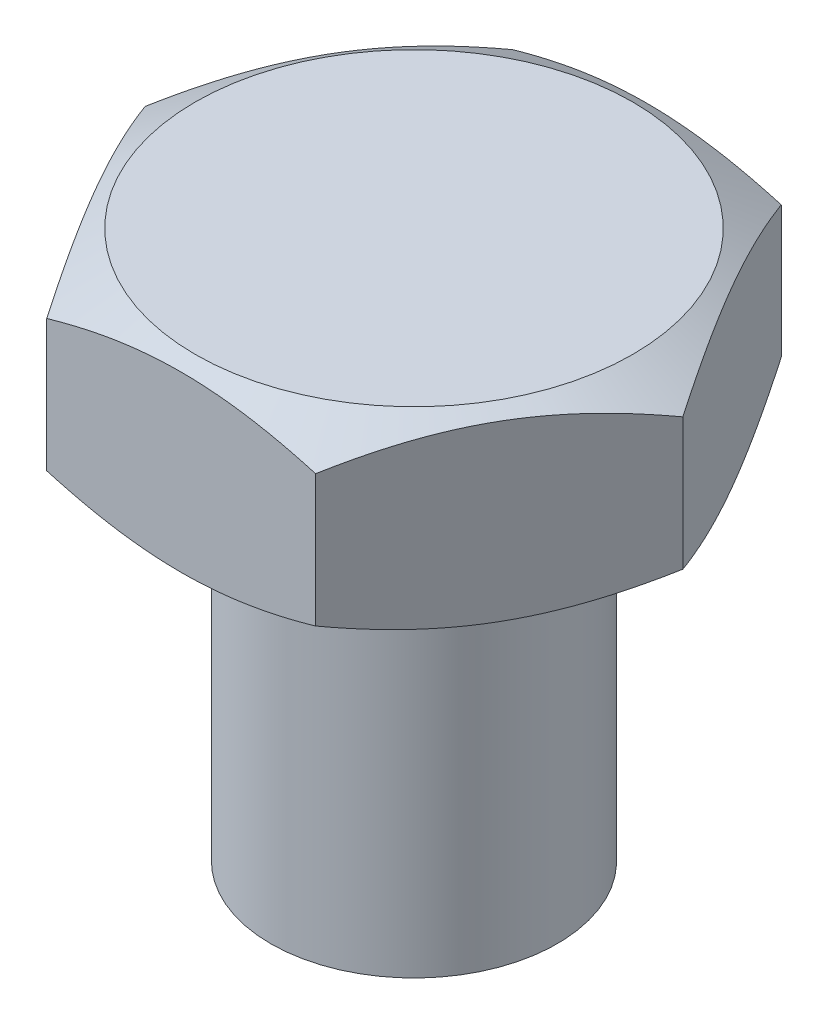
ISO-10303-21;
HEADER;
FILE_DESCRIPTION(('STEP AP214'),'2;1');
FILE_NAME('part.step','',(''),(''),'','','');
FILE_SCHEMA(('AUTOMOTIVE_DESIGN { 1 0 10303 214 1 1 1 1 }'));
ENDSEC;
DATA;
#1=APPLICATION_CONTEXT('core data for automotive mechanical design processes');
#2=APPLICATION_PROTOCOL_DEFINITION('international standard','automotive_design',2000,#1);
#3=PRODUCT_CONTEXT('',#1,'mechanical');
#4=PRODUCT('Part','Part','',(#3));
#5=PRODUCT_RELATED_PRODUCT_CATEGORY('part','',(#4));
#6=PRODUCT_DEFINITION_FORMATION('','',#4);
#7=PRODUCT_DEFINITION_CONTEXT('part definition',#1,'design');
#8=PRODUCT_DEFINITION('design','',#6,#7);
#9=PRODUCT_DEFINITION_SHAPE('','',#8);
#10=(LENGTH_UNIT() NAMED_UNIT(*) SI_UNIT(.MILLI.,.METRE.));
#11=(NAMED_UNIT(*) PLANE_ANGLE_UNIT() SI_UNIT($,.RADIAN.));
#12=(NAMED_UNIT(*) SI_UNIT($,.STERADIAN.) SOLID_ANGLE_UNIT());
#13=UNCERTAINTY_MEASURE_WITH_UNIT(LENGTH_MEASURE(1.E-05),#10,'distance_accuracy_value','');
#14=(GEOMETRIC_REPRESENTATION_CONTEXT(3) GLOBAL_UNCERTAINTY_ASSIGNED_CONTEXT((#13)) GLOBAL_UNIT_ASSIGNED_CONTEXT((#10,
#11,#12)) REPRESENTATION_CONTEXT('',''));
#15=CARTESIAN_POINT('',(0.,0.,0.));
#16=DIRECTION('',(0.,0.,1.));
#17=DIRECTION('',(1.,0.,0.));
#18=AXIS2_PLACEMENT_3D('',#15,#16,#17);
#19=CARTESIAN_POINT('',(0.,-5.3,0.));
#20=DIRECTION('',(0.,1.,0.));
#21=DIRECTION('',(0.,0.,1.));
#22=AXIS2_PLACEMENT_3D('',#19,#20,#21);
#23=PLANE('',#22);
#24=CARTESIAN_POINT('',(0.,-5.3,0.));
#25=DIRECTION('',(0.,-1.,0.));
#26=DIRECTION('',(0.,0.,-1.));
#27=AXIS2_PLACEMENT_3D('',#24,#25,#26);
#28=CIRCLE('',#27,4.);
#29=CARTESIAN_POINT('',(0.,-5.3,-4.));
#30=VERTEX_POINT('',#29);
#31=EDGE_CURVE('E11',#30,#30,#28,.T.);
#32=ORIENTED_EDGE('',*,*,#31,.F.);
#33=EDGE_LOOP('',(#32));
#34=FACE_BOUND('',#33,.T.);
#35=CARTESIAN_POINT('',(0.,-5.29999999999997,0.));
#36=DIRECTION('',(0.,-1.,0.));
#37=DIRECTION('',(1.,0.,0.));
#38=AXIS2_PLACEMENT_3D('',#35,#36,#37);
#39=CIRCLE('',#38,6.10555349946512);
#40=CARTESIAN_POINT('',(6.10555349946513,-5.29999999999995,0.));
#41=VERTEX_POINT('',#40);
#42=EDGE_CURVE('E248',#41,#41,#39,.T.);
#43=ORIENTED_EDGE('',*,*,#42,.T.);
#44=EDGE_LOOP('',(#43));
#45=FACE_BOUND('',#44,.T.);
#46=ADVANCED_FACE('F34',(#34,#45),#23,.F.);
#47=CARTESIAN_POINT('',(0.,-15.3,0.));
#48=DIRECTION('',(0.,1.,0.));
#49=DIRECTION('',(0.,0.,1.));
#50=AXIS2_PLACEMENT_3D('',#47,#48,#49);
#51=CYLINDRICAL_SURFACE('',#50,4.);
#52=CARTESIAN_POINT('',(0.,-15.3,0.));
#53=DIRECTION('',(0.,-1.,0.));
#54=DIRECTION('',(0.,0.,-1.));
#55=AXIS2_PLACEMENT_3D('',#52,#53,#54);
#56=CIRCLE('',#55,4.);
#57=CARTESIAN_POINT('',(0.,-15.3,-4.));
#58=VERTEX_POINT('',#57);
#59=EDGE_CURVE('E122',#58,#58,#56,.T.);
#60=ORIENTED_EDGE('',*,*,#59,.F.);
#61=EDGE_LOOP('',(#60));
#62=FACE_BOUND('',#61,.T.);
#63=ORIENTED_EDGE('',*,*,#31,.T.);
#64=EDGE_LOOP('',(#63));
#65=FACE_BOUND('',#64,.T.);
#66=ADVANCED_FACE('F230',(#62,#65),#51,.T.);
#67=CARTESIAN_POINT('',(0.,-15.3,0.));
#68=DIRECTION('',(0.,-1.,0.));
#69=DIRECTION('',(0.,0.,-1.));
#70=AXIS2_PLACEMENT_3D('',#67,#68,#69);
#71=PLANE('',#70);
#72=ORIENTED_EDGE('',*,*,#59,.T.);
#73=EDGE_LOOP('',(#72));
#74=FACE_BOUND('',#73,.T.);
#75=ADVANCED_FACE('F146',(#74),#71,.T.);
#76=CARTESIAN_POINT('',(0.,-4.4917096231345,0.));
#77=DIRECTION('',(0.,1.,0.));
#78=DIRECTION('',(-1.,0.,0.));
#79=AXIS2_PLACEMENT_3D('',#76,#77,#78);
#80=CONICAL_SURFACE('',#79,7.50555349946512,1.0471975511966);
#81=CARTESIAN_POINT('',(7.50566896951897,-4.49164295492937,-0.0002));
#82=CARTESIAN_POINT('',(7.4231786300702,-4.53926178365975,0.14267745905888));
#83=CARTESIAN_POINT('',(7.34038072665458,-4.58471950613253,0.286087634534912));
#84=CARTESIAN_POINT('',(7.17411251123976,-4.67071752471219,0.574072631317194));
#85=CARTESIAN_POINT('',(7.09064192560665,-4.71125569950721,0.718647926571262));
#86=CARTESIAN_POINT('',(6.83889369625719,-4.82469520561203,1.15468865052003));
#87=CARTESIAN_POINT('',(6.66962231516081,-4.8892183996065,1.44787528284632));
#88=CARTESIAN_POINT('',(6.41631077211555,-4.96487962318775,1.88662374554437));
#89=CARTESIAN_POINT('',(6.33302748139454,-4.98643335027825,2.03087463649469));
#90=CARTESIAN_POINT('',(6.16608458377293,-5.02257589212912,2.32002821713808));
#91=CARTESIAN_POINT('',(6.08242501078143,-5.03716532227557,2.46493084809888));
#92=CARTESIAN_POINT('',(5.91496056339807,-5.05900745422789,2.75498777942831));
#93=CARTESIAN_POINT('',(5.83115596252171,-5.06626848241313,2.9001416060542));
#94=CARTESIAN_POINT('',(5.66347396979287,-5.07330590415301,3.19057533697494));
#95=CARTESIAN_POINT('',(5.5795965802691,-5.07308252892304,3.33585523723635));
#96=CARTESIAN_POINT('',(5.34979921898454,-5.06218274822008,3.73387594242649));
#97=CARTESIAN_POINT('',(5.20395446807007,-5.04388438886583,3.98648646102756));
#98=CARTESIAN_POINT('',(4.91323365606636,-4.98585986527757,4.49002967823567));
#99=CARTESIAN_POINT('',(4.76835861741226,-4.946113868197,4.74096060593308));
#100=CARTESIAN_POINT('',(4.47705272008732,-4.8467603035331,5.24551722064432));
#101=CARTESIAN_POINT('',(4.33065861912703,-4.78673178109722,5.49907924143591));
#102=CARTESIAN_POINT('',(4.04005357906494,-4.65049121422538,6.00242193575904));
#103=CARTESIAN_POINT('',(3.89583891821181,-4.57431117257165,6.25220905555296));
#104=CARTESIAN_POINT('',(3.75266127967873,-4.49164295492938,6.5002));
#105=B_SPLINE_CURVE_WITH_KNOTS('',3,(#81,#82,#83,#84,#85,#86,#87,#88,#89,#90,#91,#92,#93,#94,
#95,#96,#97,#98,#99,#100,#101,#102,#103,#104),.UNSPECIFIED.,.F.,.F.,(4,2,2,2,2,2,2,2,2,2,2,4),
(0.,0.515105052395587,1.03043143507524,2.06322554824262,2.56697389547996,3.07067772176453,
3.57380860368927,4.07692394242519,4.95279354705659,5.82947446853466,6.72559912449736,
7.61996451221046),.UNSPECIFIED.);
#106=CARTESIAN_POINT('',(7.50555349946513,-4.49170962313447,0.));
#107=VERTEX_POINT('',#106);
#108=CARTESIAN_POINT('',(3.75277674973255,-4.49170962313449,6.5));
#109=VERTEX_POINT('',#108);
#110=EDGE_CURVE('E124',#107,#109,#105,.T.);
#111=ORIENTED_EDGE('',*,*,#110,.T.);
#112=CARTESIAN_POINT('',(11.3019281117872,-1.29768000423356,6.5));
#113=CARTESIAN_POINT('',(11.0315442073955,-1.43298117627786,6.50000000000001));
#114=CARTESIAN_POINT('',(10.7606895945603,-1.56735154297265,6.5));
#115=CARTESIAN_POINT('',(10.2178242665555,-1.83378067994195,6.5));
#116=CARTESIAN_POINT('',(9.94581347569086,-1.96583929587607,6.5));
#117=CARTESIAN_POINT('',(9.39990899805895,-2.2274394407436,6.5));
#118=CARTESIAN_POINT('',(9.1260126257971,-2.35697537747918,6.5));
#119=CARTESIAN_POINT('',(8.5766336187353,-2.61263099590845,6.5));
#120=CARTESIAN_POINT('',(8.30115101502996,-2.7387507442945,6.5));
#121=CARTESIAN_POINT('',(7.73583209505941,-2.992375989736,6.5));
#122=CARTESIAN_POINT('',(7.44590853713248,-3.11968766813497,6.5));
#123=CARTESIAN_POINT('',(6.86357053866705,-3.36854070197247,6.5));
#124=CARTESIAN_POINT('',(6.57115598763215,-3.49008179984887,6.5));
#125=CARTESIAN_POINT('',(5.9835492824468,-3.72575562647278,6.5));
#126=CARTESIAN_POINT('',(5.68835896417307,-3.83989290482871,6.5));
#127=CARTESIAN_POINT('',(5.09453049652117,-4.05877080224702,6.5));
#128=CARTESIAN_POINT('',(4.79589272842483,-4.16351244942186,6.5));
#129=CARTESIAN_POINT('',(4.12445080627299,-4.38402568247454,6.5));
#130=CARTESIAN_POINT('',(3.75060280171319,-4.49666688484459,6.5));
#131=CARTESIAN_POINT('',(2.99616163988092,-4.69728061936889,6.5));
#132=CARTESIAN_POINT('',(2.61556907344103,-4.78525530109634,6.5));
#133=CARTESIAN_POINT('',(2.04341381568623,-4.89254169293435,6.5));
#134=CARTESIAN_POINT('',(1.85411260014898,-4.92402360215149,6.5));
#135=CARTESIAN_POINT('',(1.47429273056311,-4.97841144020082,6.5));
#136=CARTESIAN_POINT('',(1.28377425654348,-5.00131860865851,6.5));
#137=CARTESIAN_POINT('',(0.901899889731628,-5.03787223099909,6.5));
#138=CARTESIAN_POINT('',(0.710544256730136,-5.05152137750366,6.5));
#139=CARTESIAN_POINT('',(0.327383506002614,-5.06912688399632,6.5));
#140=CARTESIAN_POINT('',(0.135578390239827,-5.07308328624151,6.5));
#141=CARTESIAN_POINT('',(-0.249151630953956,-5.07116273322381,6.5));
#142=CARTESIAN_POINT('',(-0.442076235833894,-5.06522569426935,6.5));
#143=CARTESIAN_POINT('',(-0.827373295022535,-5.04360696050267,6.5));
#144=CARTESIAN_POINT('',(-1.0197457468752,-5.02792522241226,6.5));
#145=CARTESIAN_POINT('',(-1.40357819038102,-4.98731734189005,6.5));
#146=CARTESIAN_POINT('',(-1.59503780893507,-4.96238770118649,6.5));
#147=CARTESIAN_POINT('',(-1.97664492894402,-4.90402046965219,6.5));
#148=CARTESIAN_POINT('',(-2.1667923842743,-4.87058258129199,6.5));
#149=CARTESIAN_POINT('',(-2.74136892765638,-4.75752941361289,6.5));
#150=CARTESIAN_POINT('',(-3.12345414780365,-4.66590938619134,6.5));
#151=CARTESIAN_POINT('',(-3.88101544565185,-4.45847823965152,6.5));
#152=CARTESIAN_POINT('',(-4.25648765465189,-4.34265343883489,6.5));
#153=CARTESIAN_POINT('',(-4.92324921436207,-4.11933451608864,6.5));
#154=CARTESIAN_POINT('',(-5.21567685661719,-4.01518883029879,6.5));
#155=CARTESIAN_POINT('',(-5.79717131449654,-3.79818311821834,6.5));
#156=CARTESIAN_POINT('',(-6.08623903230838,-3.68532549645334,6.5));
#157=CARTESIAN_POINT('',(-6.66178041093166,-3.4526721407869,6.5));
#158=CARTESIAN_POINT('',(-6.94825218343323,-3.33287176231593,6.5));
#159=CARTESIAN_POINT('',(-7.51886907109701,-3.08782417914273,6.5));
#160=CARTESIAN_POINT('',(-7.80301404091938,-2.96257663723022,6.5));
#161=CARTESIAN_POINT('',(-8.35731691761997,-2.71314446113502,6.5));
#162=CARTESIAN_POINT('',(-8.62755639841104,-2.5891405416267,6.49999999999999));
#163=CARTESIAN_POINT('',(-9.16651283869878,-2.33788363270034,6.49999999999999));
#164=CARTESIAN_POINT('',(-9.43522982178719,-2.21063069379639,6.49999999999999));
#165=CARTESIAN_POINT('',(-9.97090107510541,-1.95368597294006,6.49999999999999));
#166=CARTESIAN_POINT('',(-10.2378576396399,-1.82399896440976,6.49999999999999));
#167=CARTESIAN_POINT('',(-10.7706701519885,-1.56240065601994,6.49999999999999));
#168=CARTESIAN_POINT('',(-11.0365261304524,-1.4304894186281,6.49999999999999));
#169=CARTESIAN_POINT('',(-11.3019281117872,-1.29768000423363,6.49999999999999));
#170=B_SPLINE_CURVE_WITH_KNOTS('',3,(#112,#113,#114,#115,#116,#117,#118,#119,#120,#121,#122,
#123,#124,#125,#126,#127,#128,#129,#130,#131,#132,#133,#134,#135,#136,#137,#138,#139,#140,#141,
#142,#143,#144,#145,#146,#147,#148,#149,#150,#151,#152,#153,#154,#155,#156,#157,#158,#159,#160,
#161,#162,#163,#164,#165,#166,#167,#168,#169),.UNSPECIFIED.,.F.,.F.,(4,2,2,2,2,2,2,2,2,2,2,2,2,
2,2,2,2,2,2,2,2,2,2,2,2,2,2,2,4),(0.,0.907046539019097,1.81415340637229,2.72308335702887,
3.63199555033877,4.58188030800966,5.531807422736,6.48114517167283,7.43037891273764,
8.60113651357925,9.77179205657693,10.3473319165037,10.9227885401327,11.498077724955,
12.0733644017054,12.6521575905371,13.2309533499256,13.8099682782555,14.3890034572512,
15.5665682229691,16.7448004138993,17.6758961584318,18.6067358297722,19.538205568934,
20.4697330536554,21.3617036969262,22.2536604807301,23.1440206120042,24.0343557789488),.UNSPECIFIED.);
#171=CARTESIAN_POINT('',(-3.75277674973259,-4.49170962313451,6.49999999999996));
#172=VERTEX_POINT('',#171);
#173=EDGE_CURVE('E107',#109,#172,#170,.T.);
#174=ORIENTED_EDGE('',*,*,#173,.T.);
#175=CARTESIAN_POINT('',(-3.75266127967873,-4.49164295492939,6.5002));
#176=CARTESIAN_POINT('',(-3.83515161912751,-4.53926178365978,6.35732254094112));
#177=CARTESIAN_POINT('',(-3.91794952254312,-4.58471950613256,6.21391236546508));
#178=CARTESIAN_POINT('',(-4.08421773795795,-4.67071752471222,5.9259273686828));
#179=CARTESIAN_POINT('',(-4.16768832359106,-4.71125569950724,5.78135207342873));
#180=CARTESIAN_POINT('',(-4.41943655294052,-4.82469520561205,5.34531134947996));
#181=CARTESIAN_POINT('',(-4.5887079340369,-4.88921839960652,5.05212471715368));
#182=CARTESIAN_POINT('',(-4.84201947708215,-4.96487962318777,4.61337625445562));
#183=CARTESIAN_POINT('',(-4.92530276780316,-4.98643335027827,4.4691253635053));
#184=CARTESIAN_POINT('',(-5.09224566542477,-5.02257589212914,4.17997178286191));
#185=CARTESIAN_POINT('',(-5.17590523841628,-5.0371653222756,4.03506915190111));
#186=CARTESIAN_POINT('',(-5.34336968579964,-5.05900745422792,3.74501222057167));
#187=CARTESIAN_POINT('',(-5.427174286676,-5.06626848241315,3.59985839394578));
#188=CARTESIAN_POINT('',(-5.59485627940484,-5.07330590415303,3.30942466302505));
#189=CARTESIAN_POINT('',(-5.6787336689286,-5.07308252892306,3.16414476276364));
#190=CARTESIAN_POINT('',(-5.90853103021317,-5.0621827482201,2.7661240575735));
#191=CARTESIAN_POINT('',(-6.05437578112764,-5.04388438886585,2.51351353897242));
#192=CARTESIAN_POINT('',(-6.34509659313135,-4.98585986527759,2.00997032176432));
#193=CARTESIAN_POINT('',(-6.48997163178545,-4.94611386819702,1.75903939406691));
#194=CARTESIAN_POINT('',(-6.78127752911039,-4.84676030353312,1.25448277935567));
#195=CARTESIAN_POINT('',(-6.92767163007068,-4.78673178109724,1.00092075856408));
#196=CARTESIAN_POINT('',(-7.21827667013277,-4.6504912142254,0.497578064240952));
#197=CARTESIAN_POINT('',(-7.36249133098589,-4.57431117257168,0.247790944447034));
#198=CARTESIAN_POINT('',(-7.50566896951897,-4.4916429549294,-0.000200000000002116));
#199=B_SPLINE_CURVE_WITH_KNOTS('',3,(#175,#176,#177,#178,#179,#180,#181,#182,#183,#184,#185,
#186,#187,#188,#189,#190,#191,#192,#193,#194,#195,#196,#197,#198),.UNSPECIFIED.,.F.,.F.,(4,2,2,
2,2,2,2,2,2,2,2,4),(0.,0.515105052395587,1.03043143507525,2.06322554824262,2.56697389547997,
3.07067772176454,3.57380860368928,4.0769239424252,4.9527935470566,5.82947446853466,
6.72559912449736,7.61996451221045),.UNSPECIFIED.);
#200=CARTESIAN_POINT('',(-7.5055534994651,-4.49170962313452,0.));
#201=VERTEX_POINT('',#200);
#202=EDGE_CURVE('E172',#172,#201,#199,.T.);
#203=ORIENTED_EDGE('',*,*,#202,.T.);
#204=CARTESIAN_POINT('',(-7.50566896951897,-4.4916429549294,0.000199999999998251));
#205=CARTESIAN_POINT('',(-7.4231786300702,-4.53926178365978,-0.142677459058883));
#206=CARTESIAN_POINT('',(-7.34038072665458,-4.58471950613256,-0.286087634534915));
#207=CARTESIAN_POINT('',(-7.17411251123975,-4.67071752471222,-0.574072631317198));
#208=CARTESIAN_POINT('',(-7.09064192560665,-4.71125569950724,-0.718647926571267));
#209=CARTESIAN_POINT('',(-6.83889369625718,-4.82469520561206,-1.15468865052004));
#210=CARTESIAN_POINT('',(-6.6696223151608,-4.88921839960653,-1.44787528284632));
#211=CARTESIAN_POINT('',(-6.41631077211555,-4.96487962318777,-1.88662374554438));
#212=CARTESIAN_POINT('',(-6.33302748139454,-4.98643335027828,-2.0308746364947));
#213=CARTESIAN_POINT('',(-6.16608458377293,-5.02257589212915,-2.32002821713809));
#214=CARTESIAN_POINT('',(-6.08242501078142,-5.0371653222756,-2.4649308480989));
#215=CARTESIAN_POINT('',(-5.91496056339806,-5.05900745422792,-2.75498777942833));
#216=CARTESIAN_POINT('',(-5.8311559625217,-5.06626848241315,-2.90014160605422));
#217=CARTESIAN_POINT('',(-5.66347396979286,-5.07330590415303,-3.19057533697496));
#218=CARTESIAN_POINT('',(-5.57959658026909,-5.07308252892306,-3.33585523723637));
#219=CARTESIAN_POINT('',(-5.34979921898453,-5.0621827482201,-3.7338759424265));
#220=CARTESIAN_POINT('',(-5.20395446807006,-5.04388438886585,-3.98648646102758));
#221=CARTESIAN_POINT('',(-4.91323365606635,-4.98585986527759,-4.49002967823569));
#222=CARTESIAN_POINT('',(-4.76835861741225,-4.94611386819702,-4.74096060593309));
#223=CARTESIAN_POINT('',(-4.47705272008731,-4.84676030353311,-5.24551722064433));
#224=CARTESIAN_POINT('',(-4.33065861912702,-4.78673178109723,-5.49907924143592));
#225=CARTESIAN_POINT('',(-4.04005357906493,-4.65049121422539,-6.00242193575905));
#226=CARTESIAN_POINT('',(-3.89583891821181,-4.57431117257167,-6.25220905555296));
#227=CARTESIAN_POINT('',(-3.75266127967873,-4.49164295492939,-6.5002));
#228=B_SPLINE_CURVE_WITH_KNOTS('',3,(#204,#205,#206,#207,#208,#209,#210,#211,#212,#213,#214,
#215,#216,#217,#218,#219,#220,#221,#222,#223,#224,#225,#226,#227),.UNSPECIFIED.,.F.,.F.,(4,2,2,
2,2,2,2,2,2,2,2,4),(0.,0.515105052395589,1.03043143507525,2.06322554824263,2.56697389547997,
3.07067772176454,3.57380860368928,4.07692394242521,4.95279354705661,5.82947446853467,
6.72559912449736,7.61996451221045),.UNSPECIFIED.);
#229=CARTESIAN_POINT('',(-3.75277674973252,-4.49170962313451,-6.5));
#230=VERTEX_POINT('',#229);
#231=EDGE_CURVE('E166',#201,#230,#228,.T.);
#232=ORIENTED_EDGE('',*,*,#231,.T.);
#233=CARTESIAN_POINT('',(-11.3019281117872,-1.29768000423363,-6.5));
#234=CARTESIAN_POINT('',(-11.0315442073955,-1.43298117627793,-6.50000000000001));
#235=CARTESIAN_POINT('',(-10.7606895945603,-1.56735154297272,-6.5));
#236=CARTESIAN_POINT('',(-10.2178242665555,-1.83378067994202,-6.5));
#237=CARTESIAN_POINT('',(-9.94581347569086,-1.96583929587614,-6.5));
#238=CARTESIAN_POINT('',(-9.39990899805894,-2.22743944074367,-6.5));
#239=CARTESIAN_POINT('',(-9.12601262579709,-2.35697537747925,-6.5));
#240=CARTESIAN_POINT('',(-8.57663361873528,-2.61263099590851,-6.5));
#241=CARTESIAN_POINT('',(-8.30115101502994,-2.73875074429455,-6.5));
#242=CARTESIAN_POINT('',(-7.73583209505939,-2.99237598973605,-6.5));
#243=CARTESIAN_POINT('',(-7.44590853713246,-3.11968766813502,-6.5));
#244=CARTESIAN_POINT('',(-6.86357053866703,-3.36854070197252,-6.5));
#245=CARTESIAN_POINT('',(-6.57115598763213,-3.49008179984891,-6.5));
#246=CARTESIAN_POINT('',(-5.98354928244677,-3.72575562647282,-6.5));
#247=CARTESIAN_POINT('',(-5.68835896417304,-3.83989290482875,-6.5));
#248=CARTESIAN_POINT('',(-5.09453049652114,-4.05877080224706,-6.5));
#249=CARTESIAN_POINT('',(-4.7958927284248,-4.16351244942189,-6.5));
#250=CARTESIAN_POINT('',(-4.12445080627296,-4.38402568247457,-6.5));
#251=CARTESIAN_POINT('',(-3.75060280171316,-4.49666688484461,-6.5));
#252=CARTESIAN_POINT('',(-2.99616163988089,-4.69728061936891,-6.5));
#253=CARTESIAN_POINT('',(-2.615569073441,-4.78525530109636,-6.5));
#254=CARTESIAN_POINT('',(-2.04341381568619,-4.89254169293437,-6.5));
#255=CARTESIAN_POINT('',(-1.85411260014895,-4.9240236021515,-6.5));
#256=CARTESIAN_POINT('',(-1.47429273056308,-4.97841144020083,-6.5));
#257=CARTESIAN_POINT('',(-1.28377425654345,-5.00131860865852,-6.5));
#258=CARTESIAN_POINT('',(-0.901899889731594,-5.0378722309991,-6.5));
#259=CARTESIAN_POINT('',(-0.710544256730101,-5.05152137750367,-6.5));
#260=CARTESIAN_POINT('',(-0.327383506002579,-5.06912688399632,-6.5));
#261=CARTESIAN_POINT('',(-0.135578390239791,-5.07308328624151,-6.5));
#262=CARTESIAN_POINT('',(0.249151630953991,-5.07116273322381,-6.5));
#263=CARTESIAN_POINT('',(0.442076235833929,-5.06522569426934,-6.5));
#264=CARTESIAN_POINT('',(0.82737329502257,-5.04360696050266,-6.5));
#265=CARTESIAN_POINT('',(1.01974574687524,-5.02792522241225,-6.5));
#266=CARTESIAN_POINT('',(1.40357819038106,-4.98731734189004,-6.5));
#267=CARTESIAN_POINT('',(1.5950378089351,-4.96238770118648,-6.5));
#268=CARTESIAN_POINT('',(1.97664492894405,-4.90402046965217,-6.5));
#269=CARTESIAN_POINT('',(2.16679238427433,-4.87058258129198,-6.5));
#270=CARTESIAN_POINT('',(2.74136892765641,-4.75752941361287,-6.5));
#271=CARTESIAN_POINT('',(3.12345414780369,-4.66590938619132,-6.5));
#272=CARTESIAN_POINT('',(3.88101544565188,-4.45847823965149,-6.5));
#273=CARTESIAN_POINT('',(4.25648765465192,-4.34265343883486,-6.5));
#274=CARTESIAN_POINT('',(4.92324921436209,-4.11933451608861,-6.5));
#275=CARTESIAN_POINT('',(5.21567685661721,-4.01518883029876,-6.5));
#276=CARTESIAN_POINT('',(5.79717131449656,-3.7981831182183,-6.5));
#277=CARTESIAN_POINT('',(6.0862390323084,-3.6853254964533,-6.5));
#278=CARTESIAN_POINT('',(6.66178041093168,-3.45267214078685,-6.5));
#279=CARTESIAN_POINT('',(6.94825218343325,-3.33287176231589,-6.5));
#280=CARTESIAN_POINT('',(7.51886907109702,-3.08782417914268,-6.5));
#281=CARTESIAN_POINT('',(7.8030140409194,-2.96257663723017,-6.5));
#282=CARTESIAN_POINT('',(8.35731691761998,-2.71314446113497,-6.5));
#283=CARTESIAN_POINT('',(8.62755639841106,-2.58914054162664,-6.49999999999999));
#284=CARTESIAN_POINT('',(9.16651283869879,-2.33788363270028,-6.49999999999999));
#285=CARTESIAN_POINT('',(9.4352298217872,-2.21063069379633,-6.49999999999999));
#286=CARTESIAN_POINT('',(9.97090107510541,-1.95368597293999,-6.49999999999999));
#287=CARTESIAN_POINT('',(10.2378576396399,-1.82399896440969,-6.49999999999999));
#288=CARTESIAN_POINT('',(10.7706701519885,-1.56240065601987,-6.49999999999999));
#289=CARTESIAN_POINT('',(11.0365261304524,-1.43048941862803,-6.49999999999999));
#290=CARTESIAN_POINT('',(11.3019281117872,-1.29768000423356,-6.49999999999999));
#291=B_SPLINE_CURVE_WITH_KNOTS('',3,(#233,#234,#235,#236,#237,#238,#239,#240,#241,#242,#243,
#244,#245,#246,#247,#248,#249,#250,#251,#252,#253,#254,#255,#256,#257,#258,#259,#260,#261,#262,
#263,#264,#265,#266,#267,#268,#269,#270,#271,#272,#273,#274,#275,#276,#277,#278,#279,#280,#281,
#282,#283,#284,#285,#286,#287,#288,#289,#290),.UNSPECIFIED.,.F.,.F.,(4,2,2,2,2,2,2,2,2,2,2,2,2,
2,2,2,2,2,2,2,2,2,2,2,2,2,2,2,4),(0.,0.9070465390191,1.81415340637229,2.72308335702888,
3.63199555033878,4.58188030800967,5.53180742273601,6.48114517167284,7.43037891273764,
8.60113651357926,9.77179205657694,10.3473319165037,10.9227885401327,11.498077724955,
12.0733644017054,12.6521575905371,13.2309533499256,13.8099682782556,14.3890034572512,
15.5665682229691,16.7448004138993,17.6758961584318,18.6067358297722,19.538205568934,
20.4697330536554,21.3617036969262,22.2536604807301,23.1440206120042,24.0343557789489),.UNSPECIFIED.);
#292=CARTESIAN_POINT('',(3.75277674973257,-4.49170962313448,-6.5));
#293=VERTEX_POINT('',#292);
#294=EDGE_CURVE('E52',#230,#293,#291,.T.);
#295=ORIENTED_EDGE('',*,*,#294,.T.);
#296=CARTESIAN_POINT('',(3.75266127967873,-4.49164295492938,-6.5002));
#297=CARTESIAN_POINT('',(3.83515161912751,-4.53926178365976,-6.35732254094112));
#298=CARTESIAN_POINT('',(3.91794952254313,-4.58471950613254,-6.21391236546508));
#299=CARTESIAN_POINT('',(4.08421773795795,-4.6707175247122,-5.9259273686828));
#300=CARTESIAN_POINT('',(4.16768832359106,-4.71125569950722,-5.78135207342873));
#301=CARTESIAN_POINT('',(4.41943655294052,-4.82469520561203,-5.34531134947996));
#302=CARTESIAN_POINT('',(4.5887079340369,-4.8892183996065,-5.05212471715368));
#303=CARTESIAN_POINT('',(4.84201947708215,-4.96487962318775,-4.61337625445562));
#304=CARTESIAN_POINT('',(4.92530276780316,-4.98643335027825,-4.46912536350531));
#305=CARTESIAN_POINT('',(5.09224566542477,-5.02257589212912,-4.17997178286191));
#306=CARTESIAN_POINT('',(5.17590523841628,-5.03716532227558,-4.03506915190111));
#307=CARTESIAN_POINT('',(5.34336968579964,-5.05900745422789,-3.74501222057168));
#308=CARTESIAN_POINT('',(5.427174286676,-5.06626848241313,-3.59985839394579));
#309=CARTESIAN_POINT('',(5.59485627940484,-5.07330590415301,-3.30942466302505));
#310=CARTESIAN_POINT('',(5.6787336689286,-5.07308252892304,-3.16414476276364));
#311=CARTESIAN_POINT('',(5.90853103021317,-5.06218274822008,-2.76612405757351));
#312=CARTESIAN_POINT('',(6.05437578112763,-5.04388438886583,-2.51351353897243));
#313=CARTESIAN_POINT('',(6.34509659313135,-4.98585986527756,-2.00997032176432));
#314=CARTESIAN_POINT('',(6.48997163178544,-4.94611386819699,-1.75903939406692));
#315=CARTESIAN_POINT('',(6.78127752911038,-4.84676030353309,-1.25448277935568));
#316=CARTESIAN_POINT('',(6.92767163007067,-4.78673178109721,-1.00092075856409));
#317=CARTESIAN_POINT('',(7.21827667013277,-4.65049121422537,-0.497578064240955));
#318=CARTESIAN_POINT('',(7.36249133098589,-4.57431117257164,-0.247790944447036));
#319=CARTESIAN_POINT('',(7.50566896951897,-4.49164295492937,0.000200000000000072));
#320=B_SPLINE_CURVE_WITH_KNOTS('',3,(#296,#297,#298,#299,#300,#301,#302,#303,#304,#305,#306,
#307,#308,#309,#310,#311,#312,#313,#314,#315,#316,#317,#318,#319),.UNSPECIFIED.,.F.,.F.,(4,2,2,
2,2,2,2,2,2,2,2,4),(0.,0.515105052395587,1.03043143507524,2.06322554824262,2.56697389547996,
3.07067772176453,3.57380860368927,4.07692394242519,4.9527935470566,5.82947446853466,
6.72559912449736,7.61996451221045),.UNSPECIFIED.);
#321=EDGE_CURVE('E103',#293,#107,#320,.T.);
#322=ORIENTED_EDGE('',*,*,#321,.T.);
#323=EDGE_LOOP('',(#111,#174,#203,#232,#295,#322));
#324=FACE_BOUND('',#323,.T.);
#325=ORIENTED_EDGE('',*,*,#42,.F.);
#326=EDGE_LOOP('',(#325));
#327=FACE_BOUND('',#326,.T.);
#328=ADVANCED_FACE('F140',(#324,#327),#80,.T.);
#329=CARTESIAN_POINT('',(7.50555349946513,-5.3,0.));
#330=DIRECTION('',(0.866025403784439,0.,-0.5));
#331=DIRECTION('',(-0.5,0.,-0.866025403784439));
#332=AXIS2_PLACEMENT_3D('',#329,#330,#331);
#333=PLANE('',#332);
#334=CARTESIAN_POINT('',(7.50566896951897,-0.808357045070551,0.000200000000000067));
#335=CARTESIAN_POINT('',(7.4231786300702,-0.760738216340169,-0.142677459058881));
#336=CARTESIAN_POINT('',(7.34038072665458,-0.71528049386739,-0.286087634534913));
#337=CARTESIAN_POINT('',(7.17411251123976,-0.629282475287731,-0.574072631317195));
#338=CARTESIAN_POINT('',(7.09064192560665,-0.58874430049271,-0.718647926571264));
#339=CARTESIAN_POINT('',(6.83889369625719,-0.475304794387895,-1.15468865052003));
#340=CARTESIAN_POINT('',(6.66962231516081,-0.410781600393426,-1.44787528284632));
#341=CARTESIAN_POINT('',(6.41631077211555,-0.335120376812179,-1.88662374554437));
#342=CARTESIAN_POINT('',(6.33302748139454,-0.313566649721675,-2.03087463649469));
#343=CARTESIAN_POINT('',(6.16608458377293,-0.277424107870807,-2.32002821713809));
#344=CARTESIAN_POINT('',(6.08242501078143,-0.262834677724355,-2.46493084809889));
#345=CARTESIAN_POINT('',(5.91496056339806,-0.240992545772036,-2.75498777942832));
#346=CARTESIAN_POINT('',(5.8311559625217,-0.233731517586798,-2.90014160605421));
#347=CARTESIAN_POINT('',(5.66347396979287,-0.226694095846922,-3.19057533697495));
#348=CARTESIAN_POINT('',(5.5795965802691,-0.226917471076896,-3.33585523723636));
#349=CARTESIAN_POINT('',(5.34979921898453,-0.237817251779857,-3.73387594242649));
#350=CARTESIAN_POINT('',(5.20395446807007,-0.256115611134106,-3.98648646102757));
#351=CARTESIAN_POINT('',(4.91323365606636,-0.314140134722368,-4.49002967823568));
#352=CARTESIAN_POINT('',(4.76835861741226,-0.353886131802938,-4.74096060593308));
#353=CARTESIAN_POINT('',(4.47705272008732,-0.453239696466844,-5.24551722064432));
#354=CARTESIAN_POINT('',(4.33065861912703,-0.513268218902722,-5.49907924143591));
#355=CARTESIAN_POINT('',(4.04005357906494,-0.649508785774565,-6.00242193575904));
#356=CARTESIAN_POINT('',(3.89583891821182,-0.72568882742829,-6.25220905555296));
#357=CARTESIAN_POINT('',(3.75266127967873,-0.808357045070564,-6.5002));
#358=B_SPLINE_CURVE_WITH_KNOTS('',3,(#334,#335,#336,#337,#338,#339,#340,#341,#342,#343,#344,
#345,#346,#347,#348,#349,#350,#351,#352,#353,#354,#355,#356,#357),.UNSPECIFIED.,.F.,.F.,(4,2,2,
2,2,2,2,2,2,2,2,4),(0.,0.515105052395588,1.03043143507525,2.06322554824262,2.56697389547996,
3.07067772176454,3.57380860368928,4.0769239424252,4.9527935470566,5.82947446853466,
6.72559912449736,7.61996451221045),.UNSPECIFIED.);
#359=CARTESIAN_POINT('',(7.50555349946513,-0.808290376865473,0.));
#360=VERTEX_POINT('',#359);
#361=CARTESIAN_POINT('',(3.75277674972743,-0.80829037686546,-6.50000000000296));
#362=VERTEX_POINT('',#361);
#363=EDGE_CURVE('E213',#360,#362,#358,.T.);
#364=ORIENTED_EDGE('',*,*,#363,.F.);
#365=DIRECTION('',(0.,1.,0.));
#366=VECTOR('',#365,1.);
#367=CARTESIAN_POINT('',(7.50555349946513,-5.3,0.));
#368=LINE('',#367,#366);
#369=EDGE_CURVE('E39',#107,#360,#368,.T.);
#370=ORIENTED_EDGE('',*,*,#369,.F.);
#371=ORIENTED_EDGE('',*,*,#321,.F.);
#372=DIRECTION('',(0.,1.,0.));
#373=VECTOR('',#372,1.);
#374=CARTESIAN_POINT('',(3.75277674973257,-5.3,-6.5));
#375=LINE('',#374,#373);
#376=EDGE_CURVE('E118',#293,#362,#375,.T.);
#377=ORIENTED_EDGE('',*,*,#376,.T.);
#378=EDGE_LOOP('',(#364,#370,#371,#377));
#379=FACE_BOUND('',#378,.T.);
#380=ADVANCED_FACE('F145',(#379),#333,.T.);
#381=CARTESIAN_POINT('',(3.75277674973257,-5.3,-6.5));
#382=DIRECTION('',(0.,0.,-1.));
#383=DIRECTION('',(-1.,0.,0.));
#384=AXIS2_PLACEMENT_3D('',#381,#382,#383);
#385=PLANE('',#384);
#386=CARTESIAN_POINT('',(11.3019281117872,-4.00231999576633,-6.49999999999999));
#387=CARTESIAN_POINT('',(11.0315442073955,-3.86701882372203,-6.49999999999999));
#388=CARTESIAN_POINT('',(10.7606895945603,-3.73264845702724,-6.49999999999999));
#389=CARTESIAN_POINT('',(10.2178242665555,-3.46621932005794,-6.49999999999999));
#390=CARTESIAN_POINT('',(9.94581347569086,-3.33416070412383,-6.49999999999999));
#391=CARTESIAN_POINT('',(9.39990899805895,-3.0725605592563,-6.49999999999999));
#392=CARTESIAN_POINT('',(9.1260126257971,-2.94302462252072,-6.49999999999999));
#393=CARTESIAN_POINT('',(8.5766336187353,-2.68736900409146,-6.49999999999999));
#394=CARTESIAN_POINT('',(8.30115101502996,-2.56124925570541,-6.5));
#395=CARTESIAN_POINT('',(7.73583209505941,-2.30762401026392,-6.5));
#396=CARTESIAN_POINT('',(7.44590853713248,-2.18031233186495,-6.5));
#397=CARTESIAN_POINT('',(6.86357053866705,-1.93145929802745,-6.5));
#398=CARTESIAN_POINT('',(6.57115598763215,-1.80991820015106,-6.5));
#399=CARTESIAN_POINT('',(5.9835492824468,-1.57424437352715,-6.5));
#400=CARTESIAN_POINT('',(5.68835896417308,-1.46010709517122,-6.5));
#401=CARTESIAN_POINT('',(5.09453049652117,-1.24122919775291,-6.5));
#402=CARTESIAN_POINT('',(4.79589272842484,-1.13648755057808,-6.5));
#403=CARTESIAN_POINT('',(4.124450806273,-0.915974317525401,-6.5));
#404=CARTESIAN_POINT('',(3.7506028017132,-0.803333115155355,-6.5));
#405=CARTESIAN_POINT('',(2.99616163988093,-0.60271938063106,-6.5));
#406=CARTESIAN_POINT('',(2.61556907344104,-0.514744698903609,-6.5));
#407=CARTESIAN_POINT('',(2.04341381568624,-0.407458307065598,-6.5));
#408=CARTESIAN_POINT('',(1.85411260014899,-0.375976397848463,-6.5));
#409=CARTESIAN_POINT('',(1.47429273056313,-0.321588559799134,-6.5));
#410=CARTESIAN_POINT('',(1.2837742565435,-0.298681391341446,-6.5));
#411=CARTESIAN_POINT('',(0.901899889731644,-0.262127769000866,-6.5));
#412=CARTESIAN_POINT('',(0.710544256730152,-0.248478622496295,-6.5));
#413=CARTESIAN_POINT('',(0.327383506002631,-0.230873116003642,-6.5));
#414=CARTESIAN_POINT('',(0.135578390239844,-0.226916713758454,-6.5));
#415=CARTESIAN_POINT('',(-0.249151630953937,-0.228837266776151,-6.5));
#416=CARTESIAN_POINT('',(-0.442076235833875,-0.234774305730617,-6.5));
#417=CARTESIAN_POINT('',(-0.827373295022515,-0.2563930394973,-6.5));
#418=CARTESIAN_POINT('',(-1.01974574687518,-0.272074777587711,-6.5));
#419=CARTESIAN_POINT('',(-1.403578190381,-0.312682658109916,-6.5));
#420=CARTESIAN_POINT('',(-1.59503780893504,-0.337612298813478,-6.5));
#421=CARTESIAN_POINT('',(-1.976644928944,-0.395979530347781,-6.5));
#422=CARTESIAN_POINT('',(-2.16679238427427,-0.42941741870798,-6.5));
#423=CARTESIAN_POINT('',(-2.74136892765635,-0.542470586387082,-6.5));
#424=CARTESIAN_POINT('',(-3.12345414780362,-0.634090613808637,-6.5));
#425=CARTESIAN_POINT('',(-3.88101544565181,-0.841521760348461,-6.5));
#426=CARTESIAN_POINT('',(-4.25648765465186,-0.957346561165091,-6.5));
#427=CARTESIAN_POINT('',(-4.92324921436203,-1.18066548391135,-6.5));
#428=CARTESIAN_POINT('',(-5.21567685661715,-1.28481116970119,-6.5));
#429=CARTESIAN_POINT('',(-5.7971713144965,-1.50181688178166,-6.5));
#430=CARTESIAN_POINT('',(-6.08623903230835,-1.61467450354665,-6.5));
#431=CARTESIAN_POINT('',(-6.66178041093163,-1.8473278592131,-6.5));
#432=CARTESIAN_POINT('',(-6.9482521834332,-1.96712823768407,-6.5));
#433=CARTESIAN_POINT('',(-7.51886907109699,-2.21217582085728,-6.5));
#434=CARTESIAN_POINT('',(-7.80301404091936,-2.33742336276979,-6.5));
#435=CARTESIAN_POINT('',(-8.35731691761995,-2.586855538865,-6.5));
#436=CARTESIAN_POINT('',(-8.62755639841103,-2.71085945837333,-6.5));
#437=CARTESIAN_POINT('',(-9.16651283869877,-2.96211636729969,-6.5));
#438=CARTESIAN_POINT('',(-9.43522982178717,-3.08936930620364,-6.5));
#439=CARTESIAN_POINT('',(-9.97090107510539,-3.34631402705998,-6.5));
#440=CARTESIAN_POINT('',(-10.2378576396399,-3.47600103559028,-6.5));
#441=CARTESIAN_POINT('',(-10.7706701519885,-3.7375993439801,-6.5));
#442=CARTESIAN_POINT('',(-11.0365261304523,-3.86951058137196,-6.50000000000001));
#443=CARTESIAN_POINT('',(-11.3019281117872,-4.00231999576642,-6.5));
#444=B_SPLINE_CURVE_WITH_KNOTS('',3,(#386,#387,#388,#389,#390,#391,#392,#393,#394,#395,#396,
#397,#398,#399,#400,#401,#402,#403,#404,#405,#406,#407,#408,#409,#410,#411,#412,#413,#414,#415,
#416,#417,#418,#419,#420,#421,#422,#423,#424,#425,#426,#427,#428,#429,#430,#431,#432,#433,#434,
#435,#436,#437,#438,#439,#440,#441,#442,#443),.UNSPECIFIED.,.F.,.F.,(4,2,2,2,2,2,2,2,2,2,2,2,2,
2,2,2,2,2,2,2,2,2,2,2,2,2,2,2,4),(0.,0.907046539019096,1.81415340637229,2.72308335702887,
3.63199555033876,4.58188030800965,5.53180742273599,6.48114517167281,7.43037891273761,
8.60113651357923,9.7717920565769,10.3473319165037,10.9227885401326,11.4980777249549,
12.0733644017054,12.652157590537,13.2309533499256,13.8099682782555,14.3890034572512,
15.5665682229691,16.7448004138992,17.6758961584317,18.6067358297722,19.5382055689339,
20.4697330536554,21.3617036969261,22.2536604807301,23.1440206120042,24.0343557789489),.UNSPECIFIED.);
#445=CARTESIAN_POINT('',(-3.75277674973256,-0.808290376865485,-6.5));
#446=VERTEX_POINT('',#445);
#447=EDGE_CURVE('E207',#362,#446,#444,.T.);
#448=ORIENTED_EDGE('',*,*,#447,.F.);
#449=ORIENTED_EDGE('',*,*,#376,.F.);
#450=ORIENTED_EDGE('',*,*,#294,.F.);
#451=DIRECTION('',(0.,1.,0.));
#452=VECTOR('',#451,1.);
#453=CARTESIAN_POINT('',(-3.75277674973256,-5.3,-6.5));
#454=LINE('',#453,#452);
#455=EDGE_CURVE('E116',#230,#446,#454,.T.);
#456=ORIENTED_EDGE('',*,*,#455,.T.);
#457=EDGE_LOOP('',(#448,#449,#450,#456));
#458=FACE_BOUND('',#457,.T.);
#459=ADVANCED_FACE('F219',(#458),#385,.T.);
#460=CARTESIAN_POINT('',(-3.75277674973256,-5.3,-6.5));
#461=DIRECTION('',(-0.866025403784439,0.,-0.5));
#462=DIRECTION('',(-0.5,0.,0.866025403784439));
#463=AXIS2_PLACEMENT_3D('',#460,#461,#462);
#464=PLANE('',#463);
#465=CARTESIAN_POINT('',(-3.75266127967873,-0.808357045070592,-6.5002));
#466=CARTESIAN_POINT('',(-3.8351516191275,-0.760738216340211,-6.35732254094112));
#467=CARTESIAN_POINT('',(-3.91794952254312,-0.715280493867432,-6.21391236546509));
#468=CARTESIAN_POINT('',(-4.08421773795794,-0.629282475287771,-5.9259273686828));
#469=CARTESIAN_POINT('',(-4.16768832359105,-0.588744300492751,-5.78135207342874));
#470=CARTESIAN_POINT('',(-4.41943655294051,-0.475304794387934,-5.34531134947997));
#471=CARTESIAN_POINT('',(-4.58870793403689,-0.410781600393465,-5.05212471715368));
#472=CARTESIAN_POINT('',(-4.84201947708215,-0.335120376812218,-4.61337625445563));
#473=CARTESIAN_POINT('',(-4.92530276780316,-0.313566649721714,-4.46912536350531));
#474=CARTESIAN_POINT('',(-5.09224566542477,-0.277424107870846,-4.17997178286191));
#475=CARTESIAN_POINT('',(-5.17590523841627,-0.262834677724394,-4.03506915190111));
#476=CARTESIAN_POINT('',(-5.34336968579964,-0.240992545772075,-3.74501222057168));
#477=CARTESIAN_POINT('',(-5.427174286676,-0.233731517586837,-3.59985839394579));
#478=CARTESIAN_POINT('',(-5.59485627940483,-0.226694095846961,-3.30942466302505));
#479=CARTESIAN_POINT('',(-5.6787336689286,-0.226917471076934,-3.16414476276364));
#480=CARTESIAN_POINT('',(-5.90853103021317,-0.237817251779895,-2.76612405757351));
#481=CARTESIAN_POINT('',(-6.05437578112763,-0.256115611134143,-2.51351353897243));
#482=CARTESIAN_POINT('',(-6.34509659313134,-0.314140134722407,-2.00997032176432));
#483=CARTESIAN_POINT('',(-6.48997163178544,-0.353886131802978,-1.75903939406692));
#484=CARTESIAN_POINT('',(-6.78127752911038,-0.453239696466884,-1.25448277935568));
#485=CARTESIAN_POINT('',(-6.92767163007067,-0.513268218902762,-1.00092075856409));
#486=CARTESIAN_POINT('',(-7.21827667013277,-0.649508785774604,-0.497578064240956));
#487=CARTESIAN_POINT('',(-7.36249133098589,-0.725688827428329,-0.247790944447038));
#488=CARTESIAN_POINT('',(-7.50566896951897,-0.808357045070605,0.000199999999998235));
#489=B_SPLINE_CURVE_WITH_KNOTS('',3,(#465,#466,#467,#468,#469,#470,#471,#472,#473,#474,#475,
#476,#477,#478,#479,#480,#481,#482,#483,#484,#485,#486,#487,#488),.UNSPECIFIED.,.F.,.F.,(4,2,2,
2,2,2,2,2,2,2,2,4),(0.,0.515105052395588,1.03043143507525,2.06322554824262,2.56697389547996,
3.07067772176454,3.57380860368928,4.0769239424252,4.9527935470566,5.82947446853466,
6.72559912449736,7.61996451221046),.UNSPECIFIED.);
#490=CARTESIAN_POINT('',(-7.50555349946513,-0.808290376865498,-5.94706575651749E-12));
#491=VERTEX_POINT('',#490);
#492=EDGE_CURVE('E193',#446,#491,#489,.T.);
#493=ORIENTED_EDGE('',*,*,#492,.F.);
#494=ORIENTED_EDGE('',*,*,#455,.F.);
#495=ORIENTED_EDGE('',*,*,#231,.F.);
#496=DIRECTION('',(0.,1.,0.));
#497=VECTOR('',#496,1.);
#498=CARTESIAN_POINT('',(-7.50555349946513,-5.3,0.));
#499=LINE('',#498,#497);
#500=EDGE_CURVE('E110',#201,#491,#499,.T.);
#501=ORIENTED_EDGE('',*,*,#500,.T.);
#502=EDGE_LOOP('',(#493,#494,#495,#501));
#503=FACE_BOUND('',#502,.T.);
#504=ADVANCED_FACE('F181',(#503),#464,.T.);
#505=CARTESIAN_POINT('',(-7.50555349946513,-5.3,0.));
#506=DIRECTION('',(-0.866025403784439,0.,0.5));
#507=DIRECTION('',(0.5,0.,0.866025403784439));
#508=AXIS2_PLACEMENT_3D('',#505,#506,#507);
#509=PLANE('',#508);
#510=CARTESIAN_POINT('',(-7.50566896951897,-0.808357045070606,-0.000200000000001788));
#511=CARTESIAN_POINT('',(-7.4231786300702,-0.760738216340224,0.142677459058879));
#512=CARTESIAN_POINT('',(-7.34038072665458,-0.715280493867444,0.286087634534911));
#513=CARTESIAN_POINT('',(-7.17411251123976,-0.629282475287783,0.574072631317193));
#514=CARTESIAN_POINT('',(-7.09064192560665,-0.588744300492761,0.718647926571262));
#515=CARTESIAN_POINT('',(-6.83889369625719,-0.475304794387942,1.15468865052003));
#516=CARTESIAN_POINT('',(-6.66962231516081,-0.410781600393472,1.44787528284632));
#517=CARTESIAN_POINT('',(-6.41631077211555,-0.335120376812224,1.88662374554437));
#518=CARTESIAN_POINT('',(-6.33302748139454,-0.31356664972172,2.03087463649469));
#519=CARTESIAN_POINT('',(-6.16608458377293,-0.277424107870851,2.32002821713809));
#520=CARTESIAN_POINT('',(-6.08242501078143,-0.262834677724398,2.46493084809889));
#521=CARTESIAN_POINT('',(-5.91496056339806,-0.240992545772078,2.75498777942832));
#522=CARTESIAN_POINT('',(-5.8311559625217,-0.233731517586838,2.90014160605421));
#523=CARTESIAN_POINT('',(-5.66347396979287,-0.226694095846961,3.19057533697495));
#524=CARTESIAN_POINT('',(-5.5795965802691,-0.226917471076934,3.33585523723636));
#525=CARTESIAN_POINT('',(-5.34979921898453,-0.237817251779894,3.73387594242649));
#526=CARTESIAN_POINT('',(-5.20395446807007,-0.256115611134142,3.98648646102757));
#527=CARTESIAN_POINT('',(-4.91323365606636,-0.314140134722402,4.49002967823568));
#528=CARTESIAN_POINT('',(-4.76835861741226,-0.353886131802971,4.74096060593308));
#529=CARTESIAN_POINT('',(-4.47705272008732,-0.453239696466875,5.24551722064432));
#530=CARTESIAN_POINT('',(-4.33065861912703,-0.513268218902752,5.49907924143591));
#531=CARTESIAN_POINT('',(-4.04005357906494,-0.649508785774593,6.00242193575904));
#532=CARTESIAN_POINT('',(-3.89583891821182,-0.725688827428317,6.25220905555296));
#533=CARTESIAN_POINT('',(-3.75266127967873,-0.808357045070591,6.5002));
#534=B_SPLINE_CURVE_WITH_KNOTS('',3,(#510,#511,#512,#513,#514,#515,#516,#517,#518,#519,#520,
#521,#522,#523,#524,#525,#526,#527,#528,#529,#530,#531,#532,#533),.UNSPECIFIED.,.F.,.F.,(4,2,2,
2,2,2,2,2,2,2,2,4),(0.,0.515105052395588,1.03043143507525,2.06322554824262,2.56697389547996,
3.07067772176454,3.57380860368928,4.0769239424252,4.9527935470566,5.82947446853466,
6.72559912449736,7.61996451221045),.UNSPECIFIED.);
#535=CARTESIAN_POINT('',(-3.75277674973772,-0.808290376865485,6.49999999999702));
#536=VERTEX_POINT('',#535);
#537=EDGE_CURVE('E92',#491,#536,#534,.T.);
#538=ORIENTED_EDGE('',*,*,#537,.F.);
#539=ORIENTED_EDGE('',*,*,#500,.F.);
#540=ORIENTED_EDGE('',*,*,#202,.F.);
#541=DIRECTION('',(0.,1.,0.));
#542=VECTOR('',#541,1.);
#543=CARTESIAN_POINT('',(-3.75277674973257,-5.3,6.5));
#544=LINE('',#543,#542);
#545=EDGE_CURVE('E108',#172,#536,#544,.T.);
#546=ORIENTED_EDGE('',*,*,#545,.T.);
#547=EDGE_LOOP('',(#538,#539,#540,#546));
#548=FACE_BOUND('',#547,.T.);
#549=ADVANCED_FACE('F178',(#548),#509,.T.);
#550=CARTESIAN_POINT('',(-3.75277674973257,-5.3,6.5));
#551=DIRECTION('',(0.,0.,1.));
#552=DIRECTION('',(1.,0.,0.));
#553=AXIS2_PLACEMENT_3D('',#550,#551,#552);
#554=PLANE('',#553);
#555=CARTESIAN_POINT('',(-11.3019281117872,-4.00231999576642,6.49999999999999));
#556=CARTESIAN_POINT('',(-11.0315442073955,-3.86701882372212,6.49999999999999));
#557=CARTESIAN_POINT('',(-10.7606895945603,-3.73264845702733,6.49999999999999));
#558=CARTESIAN_POINT('',(-10.2178242665555,-3.46621932005803,6.49999999999999));
#559=CARTESIAN_POINT('',(-9.94581347569087,-3.33416070412391,6.49999999999999));
#560=CARTESIAN_POINT('',(-9.39990899805895,-3.07256055925638,6.49999999999999));
#561=CARTESIAN_POINT('',(-9.12601262579711,-2.94302462252079,6.49999999999999));
#562=CARTESIAN_POINT('',(-8.5766336187353,-2.68736900409153,6.49999999999999));
#563=CARTESIAN_POINT('',(-8.30115101502996,-2.56124925570548,6.5));
#564=CARTESIAN_POINT('',(-7.73583209505942,-2.30762401026398,6.5));
#565=CARTESIAN_POINT('',(-7.44590853713249,-2.18031233186501,6.5));
#566=CARTESIAN_POINT('',(-6.86357053866706,-1.93145929802751,6.5));
#567=CARTESIAN_POINT('',(-6.57115598763216,-1.80991820015111,6.5));
#568=CARTESIAN_POINT('',(-5.98354928244681,-1.5742443735272,6.5));
#569=CARTESIAN_POINT('',(-5.68835896417309,-1.46010709517127,6.5));
#570=CARTESIAN_POINT('',(-5.09453049652118,-1.24122919775295,6.5));
#571=CARTESIAN_POINT('',(-4.79589272842485,-1.13648755057812,6.5));
#572=CARTESIAN_POINT('',(-4.12445080627301,-0.915974317525436,6.5));
#573=CARTESIAN_POINT('',(-3.75060280171322,-0.803333115155386,6.5));
#574=CARTESIAN_POINT('',(-2.99616163988095,-0.602719380631085,6.5));
#575=CARTESIAN_POINT('',(-2.61556907344106,-0.514744698903631,6.5));
#576=CARTESIAN_POINT('',(-2.04341381568626,-0.407458307065616,6.5));
#577=CARTESIAN_POINT('',(-1.85411260014901,-0.37597639784848,6.5));
#578=CARTESIAN_POINT('',(-1.47429273056314,-0.321588559799146,6.5));
#579=CARTESIAN_POINT('',(-1.28377425654351,-0.298681391341457,6.5));
#580=CARTESIAN_POINT('',(-0.90189988973166,-0.262127769000873,6.5));
#581=CARTESIAN_POINT('',(-0.710544256730168,-0.248478622496301,6.5));
#582=CARTESIAN_POINT('',(-0.327383506002646,-0.230873116003645,6.5));
#583=CARTESIAN_POINT('',(-0.13557839023986,-0.226916713758455,6.5));
#584=CARTESIAN_POINT('',(0.249151630953921,-0.228837266776149,6.5));
#585=CARTESIAN_POINT('',(0.442076235833858,-0.234774305730614,6.5));
#586=CARTESIAN_POINT('',(0.827373295022499,-0.256393039497294,6.5));
#587=CARTESIAN_POINT('',(1.01974574687517,-0.272074777587702,6.5));
#588=CARTESIAN_POINT('',(1.40357819038098,-0.312682658109904,6.5));
#589=CARTESIAN_POINT('',(1.59503780893503,-0.337612298813465,6.5));
#590=CARTESIAN_POINT('',(1.97664492894398,-0.395979530347765,6.5));
#591=CARTESIAN_POINT('',(2.16679238427426,-0.429417418707962,6.5));
#592=CARTESIAN_POINT('',(2.74136892765634,-0.54247058638706,6.5));
#593=CARTESIAN_POINT('',(3.12345414780361,-0.634090613808611,6.5));
#594=CARTESIAN_POINT('',(3.88101544565181,-0.84152176034843,6.5));
#595=CARTESIAN_POINT('',(4.25648765465185,-0.957346561165058,6.5));
#596=CARTESIAN_POINT('',(4.92324921436203,-1.18066548391131,6.5));
#597=CARTESIAN_POINT('',(5.21567685661715,-1.28481116970115,6.5));
#598=CARTESIAN_POINT('',(5.7971713144965,-1.50181688178161,6.5));
#599=CARTESIAN_POINT('',(6.08623903230834,-1.61467450354661,6.5));
#600=CARTESIAN_POINT('',(6.66178041093163,-1.84732785921305,6.5));
#601=CARTESIAN_POINT('',(6.9482521834332,-1.96712823768402,6.5));
#602=CARTESIAN_POINT('',(7.51886907109698,-2.21217582085722,6.5));
#603=CARTESIAN_POINT('',(7.80301404091936,-2.33742336276973,6.5));
#604=CARTESIAN_POINT('',(8.35731691761995,-2.58685553886493,6.5));
#605=CARTESIAN_POINT('',(8.62755639841102,-2.71085945837326,6.5));
#606=CARTESIAN_POINT('',(9.16651283869876,-2.96211636729962,6.5));
#607=CARTESIAN_POINT('',(9.43522982178717,-3.08936930620357,6.5));
#608=CARTESIAN_POINT('',(9.9709010751054,-3.3463140270599,6.5));
#609=CARTESIAN_POINT('',(10.2378576396399,-3.4760010355902,6.5));
#610=CARTESIAN_POINT('',(10.7706701519885,-3.73759934398002,6.5));
#611=CARTESIAN_POINT('',(11.0365261304523,-3.86951058137187,6.50000000000001));
#612=CARTESIAN_POINT('',(11.3019281117872,-4.00231999576633,6.5));
#613=B_SPLINE_CURVE_WITH_KNOTS('',3,(#555,#556,#557,#558,#559,#560,#561,#562,#563,#564,#565,
#566,#567,#568,#569,#570,#571,#572,#573,#574,#575,#576,#577,#578,#579,#580,#581,#582,#583,#584,
#585,#586,#587,#588,#589,#590,#591,#592,#593,#594,#595,#596,#597,#598,#599,#600,#601,#602,#603,
#604,#605,#606,#607,#608,#609,#610,#611,#612),.UNSPECIFIED.,.F.,.F.,(4,2,2,2,2,2,2,2,2,2,2,2,2,
2,2,2,2,2,2,2,2,2,2,2,2,2,2,2,4),(0.,0.907046539019098,1.81415340637229,2.72308335702887,
3.63199555033877,4.58188030800965,5.53180742273599,6.48114517167281,7.43037891273762,
8.60113651357923,9.77179205657691,10.3473319165037,10.9227885401326,11.4980777249549,
12.0733644017054,12.652157590537,13.2309533499256,13.8099682782555,14.3890034572512,
15.5665682229691,16.7448004138992,17.6758961584318,18.6067358297722,19.5382055689339,
20.4697330536554,21.3617036969261,22.2536604807301,23.1440206120042,24.0343557789489),.UNSPECIFIED.);
#614=CARTESIAN_POINT('',(3.75277674973256,-0.80829037686546,6.5));
#615=VERTEX_POINT('',#614);
#616=EDGE_CURVE('E88',#536,#615,#613,.T.);
#617=ORIENTED_EDGE('',*,*,#616,.F.);
#618=ORIENTED_EDGE('',*,*,#545,.F.);
#619=ORIENTED_EDGE('',*,*,#173,.F.);
#620=DIRECTION('',(0.,1.,0.));
#621=VECTOR('',#620,1.);
#622=CARTESIAN_POINT('',(3.75277674973257,-5.3,6.5));
#623=LINE('',#622,#621);
#624=EDGE_CURVE('E44',#109,#615,#623,.T.);
#625=ORIENTED_EDGE('',*,*,#624,.T.);
#626=EDGE_LOOP('',(#617,#618,#619,#625));
#627=FACE_BOUND('',#626,.T.);
#628=ADVANCED_FACE('F106',(#627),#554,.T.);
#629=CARTESIAN_POINT('',(3.75277674973257,-5.3,6.5));
#630=DIRECTION('',(0.866025403784439,0.,0.5));
#631=DIRECTION('',(0.5,0.,-0.866025403784439));
#632=AXIS2_PLACEMENT_3D('',#629,#630,#631);
#633=PLANE('',#632);
#634=CARTESIAN_POINT('',(3.75266127967873,-0.808357045070565,6.5002));
#635=CARTESIAN_POINT('',(3.8351516191275,-0.760738216340182,6.35732254094112));
#636=CARTESIAN_POINT('',(3.91794952254312,-0.715280493867403,6.21391236546509));
#637=CARTESIAN_POINT('',(4.08421773795795,-0.629282475287742,5.92592736868281));
#638=CARTESIAN_POINT('',(4.16768832359105,-0.588744300492721,5.78135207342874));
#639=CARTESIAN_POINT('',(4.41943655294051,-0.475304794387903,5.34531134947997));
#640=CARTESIAN_POINT('',(4.58870793403689,-0.410781600393433,5.05212471715368));
#641=CARTESIAN_POINT('',(4.84201947708215,-0.335120376812185,4.61337625445563));
#642=CARTESIAN_POINT('',(4.92530276780316,-0.31356664972168,4.46912536350531));
#643=CARTESIAN_POINT('',(5.09224566542477,-0.277424107870811,4.17997178286191));
#644=CARTESIAN_POINT('',(5.17590523841627,-0.262834677724358,4.03506915190111));
#645=CARTESIAN_POINT('',(5.34336968579964,-0.240992545772037,3.74501222057168));
#646=CARTESIAN_POINT('',(5.427174286676,-0.233731517586798,3.59985839394579));
#647=CARTESIAN_POINT('',(5.59485627940483,-0.226694095846921,3.30942466302505));
#648=CARTESIAN_POINT('',(5.6787336689286,-0.226917471076894,3.16414476276364));
#649=CARTESIAN_POINT('',(5.90853103021317,-0.237817251779854,2.76612405757351));
#650=CARTESIAN_POINT('',(6.05437578112763,-0.256115611134102,2.51351353897243));
#651=CARTESIAN_POINT('',(6.34509659313134,-0.314140134722363,2.00997032176432));
#652=CARTESIAN_POINT('',(6.48997163178544,-0.353886131802931,1.75903939406692));
#653=CARTESIAN_POINT('',(6.78127752911038,-0.453239696466835,1.25448277935568));
#654=CARTESIAN_POINT('',(6.92767163007067,-0.513268218902712,1.00092075856409));
#655=CARTESIAN_POINT('',(7.21827667013277,-0.649508785774553,0.497578064240956));
#656=CARTESIAN_POINT('',(7.36249133098589,-0.725688827428277,0.247790944447037));
#657=CARTESIAN_POINT('',(7.50566896951897,-0.808357045070551,-0.000199999999999244));
#658=B_SPLINE_CURVE_WITH_KNOTS('',3,(#634,#635,#636,#637,#638,#639,#640,#641,#642,#643,#644,
#645,#646,#647,#648,#649,#650,#651,#652,#653,#654,#655,#656,#657),.UNSPECIFIED.,.F.,.F.,(4,2,2,
2,2,2,2,2,2,2,2,4),(0.,0.515105052395588,1.03043143507525,2.06322554824262,2.56697389547996,
3.07067772176454,3.57380860368928,4.0769239424252,4.9527935470566,5.82947446853466,
6.72559912449736,7.61996451221046),.UNSPECIFIED.);
#659=EDGE_CURVE('E60',#615,#360,#658,.T.);
#660=ORIENTED_EDGE('',*,*,#659,.F.);
#661=ORIENTED_EDGE('',*,*,#624,.F.);
#662=ORIENTED_EDGE('',*,*,#110,.F.);
#663=ORIENTED_EDGE('',*,*,#369,.T.);
#664=EDGE_LOOP('',(#660,#661,#662,#663));
#665=FACE_BOUND('',#664,.T.);
#666=ADVANCED_FACE('F36',(#665),#633,.T.);
#667=CARTESIAN_POINT('',(0.,0.,0.));
#668=DIRECTION('',(0.,-1.,0.));
#669=DIRECTION('',(1.,0.,0.));
#670=AXIS2_PLACEMENT_3D('',#667,#668,#669);
#671=CONICAL_SURFACE('',#670,6.10555349946513,1.0471975511966);
#672=ORIENTED_EDGE('',*,*,#659,.T.);
#673=ORIENTED_EDGE('',*,*,#363,.T.);
#674=ORIENTED_EDGE('',*,*,#447,.T.);
#675=ORIENTED_EDGE('',*,*,#492,.T.);
#676=ORIENTED_EDGE('',*,*,#537,.T.);
#677=ORIENTED_EDGE('',*,*,#616,.T.);
#678=EDGE_LOOP('',(#672,#673,#674,#675,#676,#677));
#679=FACE_BOUND('',#678,.T.);
#680=CARTESIAN_POINT('',(0.,0.,0.));
#681=DIRECTION('',(0.,-1.,0.));
#682=DIRECTION('',(1.,0.,0.));
#683=AXIS2_PLACEMENT_3D('',#680,#681,#682);
#684=CIRCLE('',#683,6.10555349946513);
#685=CARTESIAN_POINT('',(6.10555349946513,0.,0.));
#686=VERTEX_POINT('',#685);
#687=EDGE_CURVE('E247',#686,#686,#684,.T.);
#688=ORIENTED_EDGE('',*,*,#687,.T.);
#689=EDGE_LOOP('',(#688));
#690=FACE_BOUND('',#689,.T.);
#691=ADVANCED_FACE('F89',(#679,#690),#671,.T.);
#692=CARTESIAN_POINT('',(0.,0.,0.));
#693=DIRECTION('',(0.,1.,0.));
#694=DIRECTION('',(0.,0.,1.));
#695=AXIS2_PLACEMENT_3D('',#692,#693,#694);
#696=PLANE('',#695);
#697=ORIENTED_EDGE('',*,*,#687,.F.);
#698=EDGE_LOOP('',(#697));
#699=FACE_BOUND('',#698,.T.);
#700=ADVANCED_FACE('F239',(#699),#696,.T.);
#701=CLOSED_SHELL('',(#46,#66,#75,#328,#380,#459,#504,#549,#628,#666,#691,#700));
#702=MANIFOLD_SOLID_BREP('B2',#701);
#703=ADVANCED_BREP_SHAPE_REPRESENTATION('',(#18,#702),#14);
#704=SHAPE_DEFINITION_REPRESENTATION(#9,#703);
ENDSEC;
END-ISO-10303-21;
